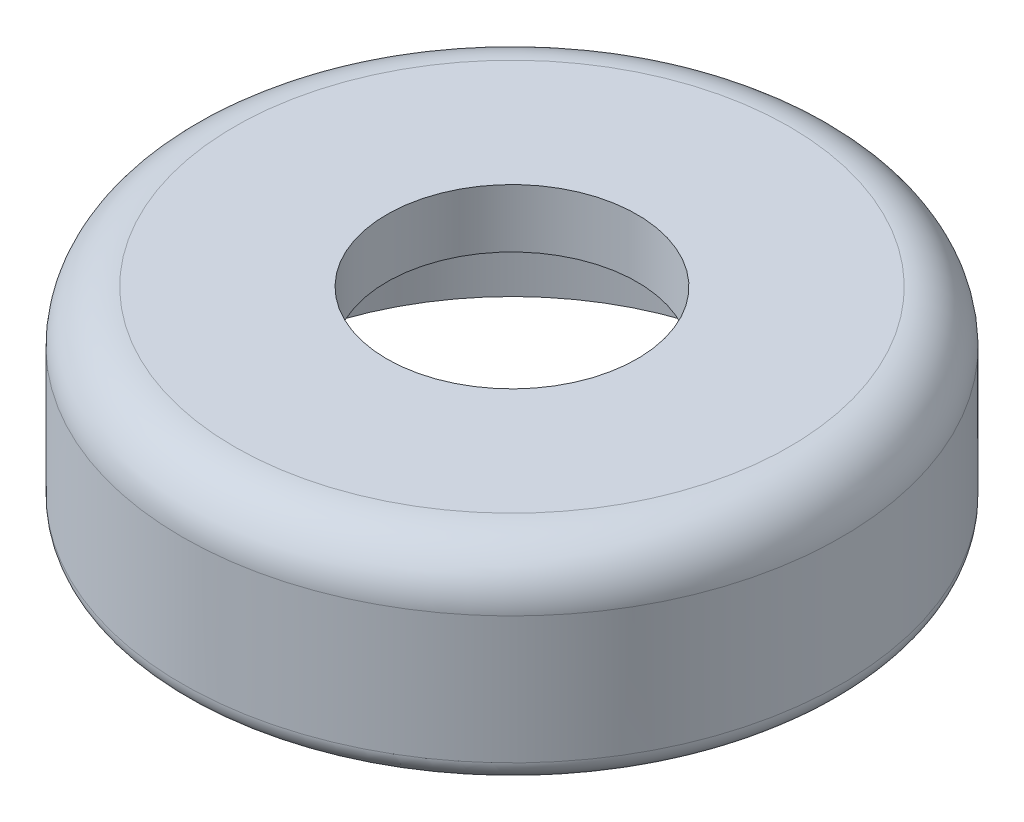
ISO-10303-21;
HEADER;
FILE_DESCRIPTION(('STEP AP214'),'2;1');
FILE_NAME('part.step','',(''),(''),'','','');
FILE_SCHEMA(('AUTOMOTIVE_DESIGN { 1 0 10303 214 1 1 1 1 }'));
ENDSEC;
DATA;
#1=APPLICATION_CONTEXT('core data for automotive mechanical design processes');
#2=APPLICATION_PROTOCOL_DEFINITION('international standard','automotive_design',2000,#1);
#3=PRODUCT_CONTEXT('',#1,'mechanical');
#4=PRODUCT('Part','Part','',(#3));
#5=PRODUCT_RELATED_PRODUCT_CATEGORY('part','',(#4));
#6=PRODUCT_DEFINITION_FORMATION('','',#4);
#7=PRODUCT_DEFINITION_CONTEXT('part definition',#1,'design');
#8=PRODUCT_DEFINITION('design','',#6,#7);
#9=PRODUCT_DEFINITION_SHAPE('','',#8);
#10=(LENGTH_UNIT() NAMED_UNIT(*) SI_UNIT(.MILLI.,.METRE.));
#11=(NAMED_UNIT(*) PLANE_ANGLE_UNIT() SI_UNIT($,.RADIAN.));
#12=(NAMED_UNIT(*) SI_UNIT($,.STERADIAN.) SOLID_ANGLE_UNIT());
#13=UNCERTAINTY_MEASURE_WITH_UNIT(LENGTH_MEASURE(1.E-05),#10,'distance_accuracy_value','');
#14=(GEOMETRIC_REPRESENTATION_CONTEXT(3) GLOBAL_UNCERTAINTY_ASSIGNED_CONTEXT((#13)) GLOBAL_UNIT_ASSIGNED_CONTEXT((#10,
#11,#12)) REPRESENTATION_CONTEXT('',''));
#15=CARTESIAN_POINT('',(0.,0.,0.));
#16=DIRECTION('',(0.,0.,1.));
#17=DIRECTION('',(1.,0.,0.));
#18=AXIS2_PLACEMENT_3D('',#15,#16,#17);
#19=CARTESIAN_POINT('',(0.,0.,0.));
#20=DIRECTION('',(0.,-1.,0.));
#21=DIRECTION('',(0.,0.,-1.));
#22=AXIS2_PLACEMENT_3D('',#19,#20,#21);
#23=CYLINDRICAL_SURFACE('',#22,8.255);
#24=CARTESIAN_POINT('',(0.,0.,0.));
#25=DIRECTION('',(0.,-1.,0.));
#26=DIRECTION('',(0.,0.,-1.));
#27=AXIS2_PLACEMENT_3D('',#24,#25,#26);
#28=CIRCLE('',#27,8.255);
#29=CARTESIAN_POINT('',(0.,0.,-8.255));
#30=VERTEX_POINT('',#29);
#31=EDGE_CURVE('E53',#30,#30,#28,.T.);
#32=ORIENTED_EDGE('',*,*,#31,.T.);
#33=EDGE_LOOP('',(#32));
#34=FACE_BOUND('',#33,.T.);
#35=CARTESIAN_POINT('',(0.,4.318,0.));
#36=DIRECTION('',(0.,-1.,0.));
#37=DIRECTION('',(0.,0.,-1.));
#38=AXIS2_PLACEMENT_3D('',#35,#36,#37);
#39=CIRCLE('',#38,8.255);
#40=CARTESIAN_POINT('',(0.,4.318,-8.255));
#41=VERTEX_POINT('',#40);
#42=EDGE_CURVE('E50',#41,#41,#39,.T.);
#43=ORIENTED_EDGE('',*,*,#42,.F.);
#44=EDGE_LOOP('',(#43));
#45=FACE_BOUND('',#44,.T.);
#46=ADVANCED_FACE('F30',(#34,#45),#23,.F.);
#47=CARTESIAN_POINT('',(0.,4.318,0.));
#48=DIRECTION('',(0.,-1.,0.));
#49=DIRECTION('',(0.,0.,-1.));
#50=AXIS2_PLACEMENT_3D('',#47,#48,#49);
#51=PLANE('',#50);
#52=CARTESIAN_POINT('',(0.,4.318,0.));
#53=DIRECTION('',(0.,-1.,0.));
#54=DIRECTION('',(0.,0.,-1.));
#55=AXIS2_PLACEMENT_3D('',#52,#53,#54);
#56=CIRCLE('',#55,3.81);
#57=CARTESIAN_POINT('',(0.,4.318,3.81));
#58=VERTEX_POINT('',#57);
#59=EDGE_CURVE('E56',#58,#58,#56,.T.);
#60=ORIENTED_EDGE('',*,*,#59,.F.);
#61=EDGE_LOOP('',(#60));
#62=FACE_BOUND('',#61,.T.);
#63=ORIENTED_EDGE('',*,*,#42,.T.);
#64=EDGE_LOOP('',(#63));
#65=FACE_BOUND('',#64,.T.);
#66=ADVANCED_FACE('F69',(#62,#65),#51,.T.);
#67=CARTESIAN_POINT('',(-10.033,6.096,0.));
#68=DIRECTION('',(0.,1.,0.));
#69=DIRECTION('',(0.,0.,1.));
#70=AXIS2_PLACEMENT_3D('',#67,#68,#69);
#71=PLANE('',#70);
#72=CARTESIAN_POINT('',(0.,6.096,0.));
#73=DIRECTION('',(0.,1.,0.));
#74=DIRECTION('',(0.,0.,1.));
#75=AXIS2_PLACEMENT_3D('',#72,#73,#74);
#76=CIRCLE('',#75,3.81);
#77=CARTESIAN_POINT('',(0.,6.096,3.81));
#78=VERTEX_POINT('',#77);
#79=EDGE_CURVE('E59',#78,#78,#76,.T.);
#80=ORIENTED_EDGE('',*,*,#79,.F.);
#81=EDGE_LOOP('',(#80));
#82=FACE_BOUND('',#81,.T.);
#83=CARTESIAN_POINT('',(0.,6.096,0.));
#84=DIRECTION('',(0.,1.,0.));
#85=DIRECTION('',(0.,0.,1.));
#86=AXIS2_PLACEMENT_3D('',#83,#84,#85);
#87=CIRCLE('',#86,8.4455);
#88=CARTESIAN_POINT('',(0.,6.096,8.4455));
#89=VERTEX_POINT('',#88);
#90=EDGE_CURVE('E41',#89,#89,#87,.T.);
#91=ORIENTED_EDGE('',*,*,#90,.T.);
#92=EDGE_LOOP('',(#91));
#93=FACE_BOUND('',#92,.T.);
#94=ADVANCED_FACE('F65',(#82,#93),#71,.T.);
#95=CARTESIAN_POINT('',(0.,0.,0.));
#96=DIRECTION('',(0.,-1.,0.));
#97=DIRECTION('',(0.,0.,-1.));
#98=AXIS2_PLACEMENT_3D('',#95,#96,#97);
#99=CYLINDRICAL_SURFACE('',#98,10.033);
#100=CARTESIAN_POINT('',(0.,0.635,0.));
#101=DIRECTION('',(0.,-1.,0.));
#102=DIRECTION('',(0.,0.,-1.));
#103=AXIS2_PLACEMENT_3D('',#100,#101,#102);
#104=CIRCLE('',#103,10.033);
#105=CARTESIAN_POINT('',(0.,0.635,-10.033));
#106=VERTEX_POINT('',#105);
#107=EDGE_CURVE('E10',#106,#106,#104,.F.);
#108=ORIENTED_EDGE('',*,*,#107,.T.);
#109=EDGE_LOOP('',(#108));
#110=FACE_BOUND('',#109,.T.);
#111=CARTESIAN_POINT('',(0.,4.5085,0.));
#112=DIRECTION('',(0.,1.,0.));
#113=DIRECTION('',(0.,0.,1.));
#114=AXIS2_PLACEMENT_3D('',#111,#112,#113);
#115=CIRCLE('',#114,10.033);
#116=CARTESIAN_POINT('',(0.,4.5085,10.033));
#117=VERTEX_POINT('',#116);
#118=EDGE_CURVE('E45',#117,#117,#115,.F.);
#119=ORIENTED_EDGE('',*,*,#118,.T.);
#120=EDGE_LOOP('',(#119));
#121=FACE_BOUND('',#120,.T.);
#122=ADVANCED_FACE('F68',(#110,#121),#99,.T.);
#123=CARTESIAN_POINT('',(-8.255,0.,0.));
#124=DIRECTION('',(0.,-1.,0.));
#125=DIRECTION('',(0.,0.,-1.));
#126=AXIS2_PLACEMENT_3D('',#123,#124,#125);
#127=PLANE('',#126);
#128=CARTESIAN_POINT('',(0.,0.,0.));
#129=DIRECTION('',(0.,-1.,0.));
#130=DIRECTION('',(0.,0.,-1.));
#131=AXIS2_PLACEMENT_3D('',#128,#129,#130);
#132=CIRCLE('',#131,9.398);
#133=CARTESIAN_POINT('',(0.,0.,-9.398));
#134=VERTEX_POINT('',#133);
#135=EDGE_CURVE('E37',#134,#134,#132,.T.);
#136=ORIENTED_EDGE('',*,*,#135,.T.);
#137=EDGE_LOOP('',(#136));
#138=FACE_BOUND('',#137,.T.);
#139=ORIENTED_EDGE('',*,*,#31,.F.);
#140=EDGE_LOOP('',(#139));
#141=FACE_BOUND('',#140,.T.);
#142=ADVANCED_FACE('F76',(#138,#141),#127,.T.);
#143=CARTESIAN_POINT('',(0.,4.5085,0.));
#144=DIRECTION('',(0.,1.,0.));
#145=DIRECTION('',(0.,0.,1.));
#146=AXIS2_PLACEMENT_3D('',#143,#144,#145);
#147=TOROIDAL_SURFACE('',#146,8.4455,1.5875);
#148=ORIENTED_EDGE('',*,*,#90,.F.);
#149=EDGE_LOOP('',(#148));
#150=FACE_BOUND('',#149,.T.);
#151=ORIENTED_EDGE('',*,*,#118,.F.);
#152=EDGE_LOOP('',(#151));
#153=FACE_BOUND('',#152,.T.);
#154=ADVANCED_FACE('F73',(#150,#153),#147,.T.);
#155=CARTESIAN_POINT('',(0.,0.,0.));
#156=DIRECTION('',(0.,1.,0.));
#157=DIRECTION('',(0.,0.,1.));
#158=AXIS2_PLACEMENT_3D('',#155,#156,#157);
#159=CYLINDRICAL_SURFACE('',#158,3.81);
#160=CARTESIAN_POINT('',(0.,4.318,3.81));
#161=CARTESIAN_POINT('',(0.,4.33652083333333,3.81));
#162=CARTESIAN_POINT('',(0.,4.35504166666667,3.81));
#163=CARTESIAN_POINT('',(0.,4.39208333333333,3.81));
#164=CARTESIAN_POINT('',(0.,4.41060416666667,3.81));
#165=CARTESIAN_POINT('',(0.,4.44764583333333,3.81));
#166=CARTESIAN_POINT('',(0.,4.46616666666667,3.81));
#167=CARTESIAN_POINT('',(0.,4.50320833333334,3.81));
#168=CARTESIAN_POINT('',(0.,4.52172916666667,3.81));
#169=CARTESIAN_POINT('',(0.,4.55877083333333,3.81));
#170=CARTESIAN_POINT('',(0.,4.57729166666667,3.81));
#171=CARTESIAN_POINT('',(0.,4.61433333333333,3.81));
#172=CARTESIAN_POINT('',(0.,4.63285416666667,3.81));
#173=CARTESIAN_POINT('',(0.,4.66989583333333,3.81));
#174=CARTESIAN_POINT('',(0.,4.68841666666667,3.81));
#175=CARTESIAN_POINT('',(0.,4.72545833333333,3.81));
#176=CARTESIAN_POINT('',(0.,4.74397916666667,3.81));
#177=CARTESIAN_POINT('',(0.,4.78102083333333,3.81));
#178=CARTESIAN_POINT('',(0.,4.79954166666667,3.81));
#179=CARTESIAN_POINT('',(0.,4.83658333333333,3.81));
#180=CARTESIAN_POINT('',(0.,4.85510416666667,3.81));
#181=CARTESIAN_POINT('',(0.,4.89214583333333,3.81));
#182=CARTESIAN_POINT('',(0.,4.91066666666667,3.81));
#183=CARTESIAN_POINT('',(0.,4.94770833333333,3.81));
#184=CARTESIAN_POINT('',(0.,4.96622916666667,3.81));
#185=CARTESIAN_POINT('',(0.,5.00327083333333,3.81));
#186=CARTESIAN_POINT('',(0.,5.02179166666667,3.81));
#187=CARTESIAN_POINT('',(0.,5.05883333333333,3.81));
#188=CARTESIAN_POINT('',(0.,5.07735416666667,3.81));
#189=CARTESIAN_POINT('',(0.,5.11439583333333,3.81));
#190=CARTESIAN_POINT('',(0.,5.13291666666667,3.81));
#191=CARTESIAN_POINT('',(0.,5.16995833333333,3.81));
#192=CARTESIAN_POINT('',(0.,5.18847916666667,3.81));
#193=CARTESIAN_POINT('',(0.,5.22552083333333,3.81));
#194=CARTESIAN_POINT('',(0.,5.24404166666667,3.81));
#195=CARTESIAN_POINT('',(0.,5.28108333333333,3.81));
#196=CARTESIAN_POINT('',(0.,5.29960416666667,3.81));
#197=CARTESIAN_POINT('',(0.,5.33664583333333,3.81));
#198=CARTESIAN_POINT('',(0.,5.35516666666667,3.81));
#199=CARTESIAN_POINT('',(0.,5.39220833333333,3.81));
#200=CARTESIAN_POINT('',(0.,5.41072916666667,3.81));
#201=CARTESIAN_POINT('',(0.,5.44777083333333,3.81));
#202=CARTESIAN_POINT('',(0.,5.46629166666667,3.81));
#203=CARTESIAN_POINT('',(0.,5.50333333333333,3.81));
#204=CARTESIAN_POINT('',(0.,5.52185416666667,3.81));
#205=CARTESIAN_POINT('',(0.,5.55889583333333,3.81));
#206=CARTESIAN_POINT('',(0.,5.57741666666667,3.81));
#207=CARTESIAN_POINT('',(0.,5.61445833333333,3.81));
#208=CARTESIAN_POINT('',(0.,5.63297916666667,3.81));
#209=CARTESIAN_POINT('',(0.,5.67002083333333,3.81));
#210=CARTESIAN_POINT('',(0.,5.68854166666667,3.81));
#211=CARTESIAN_POINT('',(0.,5.72558333333333,3.81));
#212=CARTESIAN_POINT('',(0.,5.74410416666667,3.81));
#213=CARTESIAN_POINT('',(0.,5.78114583333333,3.81));
#214=CARTESIAN_POINT('',(0.,5.79966666666667,3.81));
#215=CARTESIAN_POINT('',(0.,5.83670833333333,3.81));
#216=CARTESIAN_POINT('',(0.,5.85522916666667,3.81));
#217=CARTESIAN_POINT('',(0.,5.89227083333333,3.81));
#218=CARTESIAN_POINT('',(0.,5.91079166666667,3.81));
#219=CARTESIAN_POINT('',(0.,5.94783333333333,3.81));
#220=CARTESIAN_POINT('',(0.,5.96635416666667,3.81));
#221=CARTESIAN_POINT('',(0.,6.00339583333333,3.81));
#222=CARTESIAN_POINT('',(0.,6.02191666666667,3.81));
#223=CARTESIAN_POINT('',(0.,6.05895833333333,3.81));
#224=CARTESIAN_POINT('',(0.,6.07747916666667,3.81));
#225=CARTESIAN_POINT('',(0.,6.096,3.81));
#226=B_SPLINE_CURVE_WITH_KNOTS('',3,(#160,#161,#162,#163,#164,#165,#166,#167,#168,#169,#170,
#171,#172,#173,#174,#175,#176,#177,#178,#179,#180,#181,#182,#183,#184,#185,#186,#187,#188,#189,
#190,#191,#192,#193,#194,#195,#196,#197,#198,#199,#200,#201,#202,#203,#204,#205,#206,#207,#208,
#209,#210,#211,#212,#213,#214,#215,#216,#217,#218,#219,#220,#221,#222,#223,#224,#225),
.UNSPECIFIED.,.F.,.F.,(4,2,2,2,2,2,2,2,2,2,2,2,2,2,2,2,2,2,2,2,2,2,2,2,2,2,2,2,2,2,2,2,4),(0.,
0.0555625000000001,0.111125,0.1666875,0.22225,0.277812499999999,0.333374999999999,0.3889375,
0.4445,0.5000625,0.555625,0.6111875,0.666749999999999,0.722312499999999,0.777874999999999,
0.833437499999999,0.888999999999999,0.944562499999999,1.000125,1.0556875,1.11125,1.1668125,
1.222375,1.2779375,1.3335,1.3890625,1.444625,1.5001875,1.55575,1.6113125,1.666875,1.7224375,
1.778),.UNSPECIFIED.);
#227=EDGE_CURVE('BSEAM63',#58,#78,#226,.T.);
#228=ORIENTED_EDGE('',*,*,#59,.T.);
#229=ORIENTED_EDGE('',*,*,#79,.T.);
#230=ORIENTED_EDGE('',*,*,#227,.T.);
#231=ORIENTED_EDGE('',*,*,#227,.F.);
#232=EDGE_LOOP('',(#228,#230,#229,#231));
#233=FACE_BOUND('',#232,.T.);
#234=ADVANCED_FACE('F63',(#233),#159,.F.);
#235=CARTESIAN_POINT('',(0.,0.635,0.));
#236=DIRECTION('',(0.,-1.,0.));
#237=DIRECTION('',(0.,0.,-1.));
#238=AXIS2_PLACEMENT_3D('',#235,#236,#237);
#239=TOROIDAL_SURFACE('',#238,9.398,0.635);
#240=ORIENTED_EDGE('',*,*,#107,.F.);
#241=EDGE_LOOP('',(#240));
#242=FACE_BOUND('',#241,.T.);
#243=ORIENTED_EDGE('',*,*,#135,.F.);
#244=EDGE_LOOP('',(#243));
#245=FACE_BOUND('',#244,.T.);
#246=ADVANCED_FACE('F32',(#242,#245),#239,.T.);
#247=CLOSED_SHELL('',(#46,#66,#94,#122,#142,#154,#234,#246));
#248=MANIFOLD_SOLID_BREP('B2',#247);
#249=ADVANCED_BREP_SHAPE_REPRESENTATION('',(#18,#248),#14);
#250=SHAPE_DEFINITION_REPRESENTATION(#9,#249);
ENDSEC;
END-ISO-10303-21;
